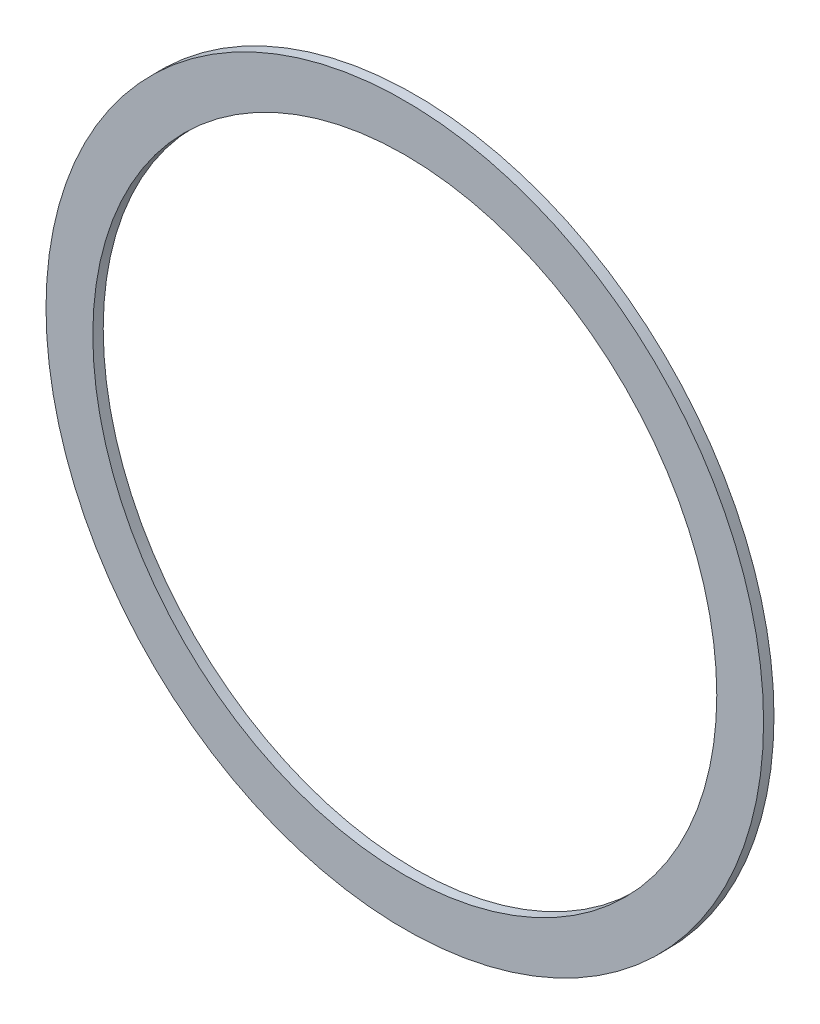
ISO-10303-21;
HEADER;
FILE_DESCRIPTION(('STEP AP214'),'2;1');
FILE_NAME('part.step','',(''),(''),'','','');
FILE_SCHEMA(('AUTOMOTIVE_DESIGN { 1 0 10303 214 1 1 1 1 }'));
ENDSEC;
DATA;
#1=APPLICATION_CONTEXT('core data for automotive mechanical design processes');
#2=APPLICATION_PROTOCOL_DEFINITION('international standard','automotive_design',2000,#1);
#3=PRODUCT_CONTEXT('',#1,'mechanical');
#4=PRODUCT('Part','Part','',(#3));
#5=PRODUCT_RELATED_PRODUCT_CATEGORY('part','',(#4));
#6=PRODUCT_DEFINITION_FORMATION('','',#4);
#7=PRODUCT_DEFINITION_CONTEXT('part definition',#1,'design');
#8=PRODUCT_DEFINITION('design','',#6,#7);
#9=PRODUCT_DEFINITION_SHAPE('','',#8);
#10=(LENGTH_UNIT() NAMED_UNIT(*) SI_UNIT(.MILLI.,.METRE.));
#11=(NAMED_UNIT(*) PLANE_ANGLE_UNIT() SI_UNIT($,.RADIAN.));
#12=(NAMED_UNIT(*) SI_UNIT($,.STERADIAN.) SOLID_ANGLE_UNIT());
#13=UNCERTAINTY_MEASURE_WITH_UNIT(LENGTH_MEASURE(1.E-05),#10,'distance_accuracy_value','');
#14=(GEOMETRIC_REPRESENTATION_CONTEXT(3) GLOBAL_UNCERTAINTY_ASSIGNED_CONTEXT((#13)) GLOBAL_UNIT_ASSIGNED_CONTEXT((#10,
#11,#12)) REPRESENTATION_CONTEXT('',''));
#15=CARTESIAN_POINT('',(0.,0.,0.));
#16=DIRECTION('',(0.,0.,1.));
#17=DIRECTION('',(1.,0.,0.));
#18=AXIS2_PLACEMENT_3D('',#15,#16,#17);
#19=CARTESIAN_POINT('',(0.,0.,1.));
#20=DIRECTION('',(0.,0.,1.));
#21=DIRECTION('',(1.,0.,0.));
#22=AXIS2_PLACEMENT_3D('',#19,#20,#21);
#23=PLANE('',#22);
#24=CARTESIAN_POINT('',(0.,0.,1.));
#25=DIRECTION('',(0.,0.,1.));
#26=DIRECTION('',(1.,0.,0.));
#27=AXIS2_PLACEMENT_3D('',#24,#25,#26);
#28=CIRCLE('',#27,69.);
#29=CARTESIAN_POINT('',(69.,0.,1.));
#30=VERTEX_POINT('',#29);
#31=EDGE_CURVE('E10',#30,#30,#28,.T.);
#32=ORIENTED_EDGE('',*,*,#31,.T.);
#33=EDGE_LOOP('',(#32));
#34=FACE_BOUND('',#33,.T.);
#35=CARTESIAN_POINT('',(0.,0.,1.));
#36=DIRECTION('',(0.,0.,1.));
#37=DIRECTION('',(1.,0.,0.));
#38=AXIS2_PLACEMENT_3D('',#35,#36,#37);
#39=CIRCLE('',#38,60.);
#40=CARTESIAN_POINT('',(60.,0.,1.));
#41=VERTEX_POINT('',#40);
#42=EDGE_CURVE('E46',#41,#41,#39,.T.);
#43=ORIENTED_EDGE('',*,*,#42,.F.);
#44=EDGE_LOOP('',(#43));
#45=FACE_BOUND('',#44,.T.);
#46=ADVANCED_FACE('F35',(#34,#45),#23,.T.);
#47=CARTESIAN_POINT('',(0.,0.,-1.));
#48=DIRECTION('',(0.,0.,1.));
#49=DIRECTION('',(1.,0.,0.));
#50=AXIS2_PLACEMENT_3D('',#47,#48,#49);
#51=PLANE('',#50);
#52=CARTESIAN_POINT('',(0.,0.,-1.));
#53=DIRECTION('',(0.,0.,1.));
#54=DIRECTION('',(1.,0.,0.));
#55=AXIS2_PLACEMENT_3D('',#52,#53,#54);
#56=CIRCLE('',#55,69.);
#57=CARTESIAN_POINT('',(69.,0.,-1.));
#58=VERTEX_POINT('',#57);
#59=EDGE_CURVE('E39',#58,#58,#56,.T.);
#60=ORIENTED_EDGE('',*,*,#59,.F.);
#61=EDGE_LOOP('',(#60));
#62=FACE_BOUND('',#61,.T.);
#63=CARTESIAN_POINT('',(0.,0.,-1.));
#64=DIRECTION('',(0.,0.,1.));
#65=DIRECTION('',(1.,0.,0.));
#66=AXIS2_PLACEMENT_3D('',#63,#64,#65);
#67=CIRCLE('',#66,60.);
#68=CARTESIAN_POINT('',(60.,0.,-1.));
#69=VERTEX_POINT('',#68);
#70=EDGE_CURVE('E48',#69,#69,#67,.T.);
#71=ORIENTED_EDGE('',*,*,#70,.T.);
#72=EDGE_LOOP('',(#71));
#73=FACE_BOUND('',#72,.T.);
#74=ADVANCED_FACE('F58',(#62,#73),#51,.F.);
#75=CARTESIAN_POINT('',(0.,0.,1.));
#76=DIRECTION('',(0.,0.,-1.));
#77=DIRECTION('',(-1.,0.,0.));
#78=AXIS2_PLACEMENT_3D('',#75,#76,#77);
#79=CYLINDRICAL_SURFACE('',#78,69.);
#80=ORIENTED_EDGE('',*,*,#31,.F.);
#81=EDGE_LOOP('',(#80));
#82=FACE_BOUND('',#81,.T.);
#83=ORIENTED_EDGE('',*,*,#59,.T.);
#84=EDGE_LOOP('',(#83));
#85=FACE_BOUND('',#84,.T.);
#86=ADVANCED_FACE('F37',(#82,#85),#79,.T.);
#87=CARTESIAN_POINT('',(0.,0.,1.));
#88=DIRECTION('',(0.,0.,-1.));
#89=DIRECTION('',(-1.,0.,0.));
#90=AXIS2_PLACEMENT_3D('',#87,#88,#89);
#91=CYLINDRICAL_SURFACE('',#90,60.);
#92=ORIENTED_EDGE('',*,*,#42,.T.);
#93=EDGE_LOOP('',(#92));
#94=FACE_BOUND('',#93,.T.);
#95=ORIENTED_EDGE('',*,*,#70,.F.);
#96=EDGE_LOOP('',(#95));
#97=FACE_BOUND('',#96,.T.);
#98=ADVANCED_FACE('F54',(#94,#97),#91,.F.);
#99=CLOSED_SHELL('',(#46,#74,#86,#98));
#100=MANIFOLD_SOLID_BREP('B2',#99);
#101=ADVANCED_BREP_SHAPE_REPRESENTATION('',(#18,#100),#14);
#102=SHAPE_DEFINITION_REPRESENTATION(#9,#101);
ENDSEC;
END-ISO-10303-21;
